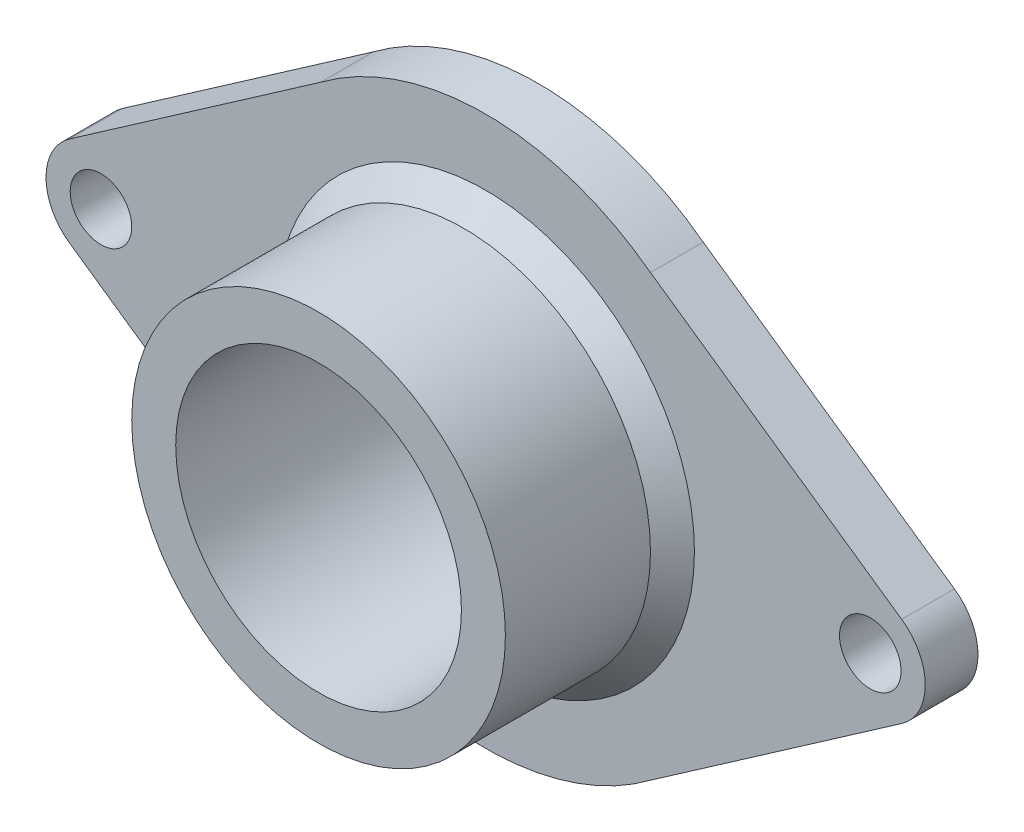
ISO-10303-21;
HEADER;
FILE_DESCRIPTION(('STEP AP214'),'2;1');
FILE_NAME('part.step','',(''),(''),'','','');
FILE_SCHEMA(('AUTOMOTIVE_DESIGN { 1 0 10303 214 1 1 1 1 }'));
ENDSEC;
DATA;
#1=APPLICATION_CONTEXT('core data for automotive mechanical design processes');
#2=APPLICATION_PROTOCOL_DEFINITION('international standard','automotive_design',2000,#1);
#3=PRODUCT_CONTEXT('',#1,'mechanical');
#4=PRODUCT('Part','Part','',(#3));
#5=PRODUCT_RELATED_PRODUCT_CATEGORY('part','',(#4));
#6=PRODUCT_DEFINITION_FORMATION('','',#4);
#7=PRODUCT_DEFINITION_CONTEXT('part definition',#1,'design');
#8=PRODUCT_DEFINITION('design','',#6,#7);
#9=PRODUCT_DEFINITION_SHAPE('','',#8);
#10=(LENGTH_UNIT() NAMED_UNIT(*) SI_UNIT(.MILLI.,.METRE.));
#11=(NAMED_UNIT(*) PLANE_ANGLE_UNIT() SI_UNIT($,.RADIAN.));
#12=(NAMED_UNIT(*) SI_UNIT($,.STERADIAN.) SOLID_ANGLE_UNIT());
#13=UNCERTAINTY_MEASURE_WITH_UNIT(LENGTH_MEASURE(1.E-05),#10,'distance_accuracy_value','');
#14=(GEOMETRIC_REPRESENTATION_CONTEXT(3) GLOBAL_UNCERTAINTY_ASSIGNED_CONTEXT((#13)) GLOBAL_UNIT_ASSIGNED_CONTEXT((#10,
#11,#12)) REPRESENTATION_CONTEXT('',''));
#15=CARTESIAN_POINT('',(0.,0.,0.));
#16=DIRECTION('',(0.,0.,1.));
#17=DIRECTION('',(1.,0.,0.));
#18=AXIS2_PLACEMENT_3D('',#15,#16,#17);
#19=CARTESIAN_POINT('',(0.,0.,50.));
#20=DIRECTION('',(0.,0.,-1.));
#21=DIRECTION('',(-1.,0.,0.));
#22=AXIS2_PLACEMENT_3D('',#19,#20,#21);
#23=CYLINDRICAL_SURFACE('',#22,42.5);
#24=CARTESIAN_POINT('',(0.,0.,16.9999999999999));
#25=DIRECTION('',(0.,0.,-1.));
#26=DIRECTION('',(-1.,0.,0.));
#27=AXIS2_PLACEMENT_3D('',#24,#25,#26);
#28=CIRCLE('',#27,42.5);
#29=CARTESIAN_POINT('',(-42.5,0.,16.9999999999999));
#30=VERTEX_POINT('',#29);
#31=EDGE_CURVE('E11',#30,#30,#28,.F.);
#32=ORIENTED_EDGE('',*,*,#31,.T.);
#33=EDGE_LOOP('',(#32));
#34=FACE_BOUND('',#33,.T.);
#35=CARTESIAN_POINT('',(0.,0.,50.));
#36=DIRECTION('',(0.,0.,1.));
#37=DIRECTION('',(1.,0.,0.));
#38=AXIS2_PLACEMENT_3D('',#35,#36,#37);
#39=CIRCLE('',#38,42.5);
#40=CARTESIAN_POINT('',(42.5,0.,50.));
#41=VERTEX_POINT('',#40);
#42=EDGE_CURVE('E170',#41,#41,#39,.T.);
#43=ORIENTED_EDGE('',*,*,#42,.F.);
#44=EDGE_LOOP('',(#43));
#45=FACE_BOUND('',#44,.T.);
#46=ADVANCED_FACE('F33',(#34,#45),#23,.T.);
#47=CARTESIAN_POINT('',(0.,0.,50.));
#48=DIRECTION('',(0.,0.,1.));
#49=DIRECTION('',(1.,0.,0.));
#50=AXIS2_PLACEMENT_3D('',#47,#48,#49);
#51=PLANE('',#50);
#52=ORIENTED_EDGE('',*,*,#42,.T.);
#53=EDGE_LOOP('',(#52));
#54=FACE_BOUND('',#53,.T.);
#55=CARTESIAN_POINT('',(0.,0.,50.));
#56=DIRECTION('',(0.,0.,1.));
#57=DIRECTION('',(1.,0.,0.));
#58=AXIS2_PLACEMENT_3D('',#55,#56,#57);
#59=CIRCLE('',#58,32.5);
#60=CARTESIAN_POINT('',(32.5,0.,50.));
#61=VERTEX_POINT('',#60);
#62=EDGE_CURVE('E167',#61,#61,#59,.T.);
#63=ORIENTED_EDGE('',*,*,#62,.F.);
#64=EDGE_LOOP('',(#63));
#65=FACE_BOUND('',#64,.T.);
#66=ADVANCED_FACE('F197',(#54,#65),#51,.T.);
#67=CARTESIAN_POINT('',(0.,0.,0.));
#68=DIRECTION('',(0.,0.,1.));
#69=DIRECTION('',(1.,0.,0.));
#70=AXIS2_PLACEMENT_3D('',#67,#68,#69);
#71=PLANE('',#70);
#72=CARTESIAN_POINT('',(-87.5000000000338,0.,0.));
#73=DIRECTION('',(0.,0.,1.));
#74=DIRECTION('',(1.,0.,0.));
#75=AXIS2_PLACEMENT_3D('',#72,#73,#74);
#76=CIRCLE('',#75,7.);
#77=CARTESIAN_POINT('',(-80.5000000000338,0.,0.));
#78=VERTEX_POINT('',#77);
#79=EDGE_CURVE('E137',#78,#78,#76,.T.);
#80=ORIENTED_EDGE('',*,*,#79,.T.);
#81=EDGE_LOOP('',(#80));
#82=FACE_BOUND('',#81,.T.);
#83=CARTESIAN_POINT('',(87.5000000000338,0.,0.));
#84=DIRECTION('',(0.,0.,1.));
#85=DIRECTION('',(1.,0.,0.));
#86=AXIS2_PLACEMENT_3D('',#83,#84,#85);
#87=CIRCLE('',#86,7.);
#88=CARTESIAN_POINT('',(94.5000000000338,0.,0.));
#89=VERTEX_POINT('',#88);
#90=EDGE_CURVE('E178',#89,#89,#87,.T.);
#91=ORIENTED_EDGE('',*,*,#90,.T.);
#92=EDGE_LOOP('',(#91));
#93=FACE_BOUND('',#92,.T.);
#94=CARTESIAN_POINT('',(0.,0.,0.));
#95=DIRECTION('',(0.,0.,1.));
#96=DIRECTION('',(1.,0.,0.));
#97=AXIS2_PLACEMENT_3D('',#94,#95,#96);
#98=CIRCLE('',#97,32.5);
#99=CARTESIAN_POINT('',(32.5,0.,0.));
#100=VERTEX_POINT('',#99);
#101=EDGE_CURVE('E157',#100,#100,#98,.T.);
#102=ORIENTED_EDGE('',*,*,#101,.T.);
#103=EDGE_LOOP('',(#102));
#104=FACE_BOUND('',#103,.T.);
#105=CARTESIAN_POINT('',(0.,0.,0.));
#106=DIRECTION('',(0.,0.,-1.));
#107=DIRECTION('',(-1.,0.,0.));
#108=AXIS2_PLACEMENT_3D('',#105,#106,#107);
#109=CIRCLE('',#108,62.5);
#110=CARTESIAN_POINT('',(37.5000000007826,-49.9999999994131,0.));
#111=VERTEX_POINT('',#110);
#112=CARTESIAN_POINT('',(-37.5000000007826,-49.9999999994131,0.));
#113=VERTEX_POINT('',#112);
#114=EDGE_CURVE('E133',#111,#113,#109,.T.);
#115=ORIENTED_EDGE('',*,*,#114,.T.);
#116=DIRECTION('',(-0.820970545354198,0.570970545353112,0.));
#117=VECTOR('',#116,1.);
#118=CARTESIAN_POINT('',(-37.5000000007826,-49.9999999994131,0.));
#119=LINE('',#118,#117);
#120=CARTESIAN_POINT('',(-94.6371318169477,-10.2621318169275,0.));
#121=VERTEX_POINT('',#120);
#122=EDGE_CURVE('E136',#113,#121,#119,.T.);
#123=ORIENTED_EDGE('',*,*,#122,.T.);
#124=CARTESIAN_POINT('',(-87.5000000000338,0.,0.));
#125=DIRECTION('',(0.,0.,-1.));
#126=DIRECTION('',(-1.,0.,0.));
#127=AXIS2_PLACEMENT_3D('',#124,#125,#126);
#128=CIRCLE('',#127,12.5);
#129=CARTESIAN_POINT('',(-94.6371318169477,10.2621318169275,0.));
#130=VERTEX_POINT('',#129);
#131=EDGE_CURVE('E140',#121,#130,#128,.T.);
#132=ORIENTED_EDGE('',*,*,#131,.T.);
#133=DIRECTION('',(0.820970545354198,0.570970545353112,0.));
#134=VECTOR('',#133,1.);
#135=CARTESIAN_POINT('',(-37.5000000007826,49.9999999994131,0.));
#136=LINE('',#135,#134);
#137=CARTESIAN_POINT('',(-37.5000000007826,49.9999999994131,0.));
#138=VERTEX_POINT('',#137);
#139=EDGE_CURVE('E143',#130,#138,#136,.T.);
#140=ORIENTED_EDGE('',*,*,#139,.T.);
#141=CARTESIAN_POINT('',(0.,0.,0.));
#142=DIRECTION('',(0.,0.,-1.));
#143=DIRECTION('',(-1.,0.,0.));
#144=AXIS2_PLACEMENT_3D('',#141,#142,#143);
#145=CIRCLE('',#144,62.5);
#146=CARTESIAN_POINT('',(37.5000000007826,49.9999999994131,0.));
#147=VERTEX_POINT('',#146);
#148=EDGE_CURVE('E146',#138,#147,#145,.T.);
#149=ORIENTED_EDGE('',*,*,#148,.T.);
#150=DIRECTION('',(0.820970545354198,-0.570970545353112,0.));
#151=VECTOR('',#150,1.);
#152=CARTESIAN_POINT('',(37.5000000007826,49.9999999994131,0.));
#153=LINE('',#152,#151);
#154=CARTESIAN_POINT('',(94.6371318169477,10.2621318169275,0.));
#155=VERTEX_POINT('',#154);
#156=EDGE_CURVE('E149',#147,#155,#153,.T.);
#157=ORIENTED_EDGE('',*,*,#156,.T.);
#158=CARTESIAN_POINT('',(87.5000000000338,0.,0.));
#159=DIRECTION('',(0.,0.,-1.));
#160=DIRECTION('',(-1.,0.,0.));
#161=AXIS2_PLACEMENT_3D('',#158,#159,#160);
#162=CIRCLE('',#161,12.5);
#163=CARTESIAN_POINT('',(94.6371318169477,-10.2621318169275,0.));
#164=VERTEX_POINT('',#163);
#165=EDGE_CURVE('E110',#155,#164,#162,.T.);
#166=ORIENTED_EDGE('',*,*,#165,.T.);
#167=DIRECTION('',(-0.820970545354199,-0.570970545353112,0.));
#168=VECTOR('',#167,1.);
#169=CARTESIAN_POINT('',(37.5000000007826,-49.9999999994131,0.));
#170=LINE('',#169,#168);
#171=EDGE_CURVE('E152',#164,#111,#170,.T.);
#172=ORIENTED_EDGE('',*,*,#171,.T.);
#173=EDGE_LOOP('',(#115,#123,#132,#140,#149,#157,#166,#172));
#174=FACE_BOUND('',#173,.T.);
#175=ADVANCED_FACE('F204',(#82,#93,#104,#174),#71,.F.);
#176=CARTESIAN_POINT('',(0.,0.,50.));
#177=DIRECTION('',(0.,0.,-1.));
#178=DIRECTION('',(-1.,0.,0.));
#179=AXIS2_PLACEMENT_3D('',#176,#177,#178);
#180=CYLINDRICAL_SURFACE('',#179,32.5);
#181=ORIENTED_EDGE('',*,*,#62,.T.);
#182=EDGE_LOOP('',(#181));
#183=FACE_BOUND('',#182,.T.);
#184=ORIENTED_EDGE('',*,*,#101,.F.);
#185=EDGE_LOOP('',(#184));
#186=FACE_BOUND('',#185,.T.);
#187=ADVANCED_FACE('F210',(#183,#186),#180,.F.);
#188=CARTESIAN_POINT('',(0.,0.,12.));
#189=DIRECTION('',(0.,0.,-1.));
#190=DIRECTION('',(-1.,0.,0.));
#191=AXIS2_PLACEMENT_3D('',#188,#189,#190);
#192=CYLINDRICAL_SURFACE('',#191,62.5);
#193=ORIENTED_EDGE('',*,*,#114,.F.);
#194=DIRECTION('',(0.,0.,-1.));
#195=VECTOR('',#194,1.);
#196=CARTESIAN_POINT('',(37.5000000007826,-49.9999999994131,12.));
#197=LINE('',#196,#195);
#198=CARTESIAN_POINT('',(37.5000000007826,-49.9999999994131,12.));
#199=VERTEX_POINT('',#198);
#200=EDGE_CURVE('E50',#199,#111,#197,.T.);
#201=ORIENTED_EDGE('',*,*,#200,.F.);
#202=CARTESIAN_POINT('',(0.,0.,12.));
#203=DIRECTION('',(0.,0.,-1.));
#204=DIRECTION('',(-1.,0.,0.));
#205=AXIS2_PLACEMENT_3D('',#202,#203,#204);
#206=CIRCLE('',#205,62.5);
#207=CARTESIAN_POINT('',(-37.5000000007826,-49.9999999994131,12.));
#208=VERTEX_POINT('',#207);
#209=EDGE_CURVE('E155',#199,#208,#206,.T.);
#210=ORIENTED_EDGE('',*,*,#209,.T.);
#211=DIRECTION('',(0.,0.,-1.));
#212=VECTOR('',#211,1.);
#213=CARTESIAN_POINT('',(-37.5000000007826,-49.9999999994131,12.));
#214=LINE('',#213,#212);
#215=EDGE_CURVE('E91',#208,#113,#214,.T.);
#216=ORIENTED_EDGE('',*,*,#215,.T.);
#217=EDGE_LOOP('',(#193,#201,#210,#216));
#218=FACE_BOUND('',#217,.T.);
#219=ADVANCED_FACE('F215',(#218),#192,.T.);
#220=CARTESIAN_POINT('',(37.5000000007826,-49.9999999994131,12.));
#221=DIRECTION('',(0.570970545353112,-0.820970545354199,0.));
#222=DIRECTION('',(0.820970545354199,0.570970545353112,0.));
#223=AXIS2_PLACEMENT_3D('',#220,#221,#222);
#224=PLANE('',#223);
#225=ORIENTED_EDGE('',*,*,#171,.F.);
#226=DIRECTION('',(0.,0.,-1.));
#227=VECTOR('',#226,1.);
#228=CARTESIAN_POINT('',(94.6371318169477,-10.2621318169275,12.));
#229=LINE('',#228,#227);
#230=CARTESIAN_POINT('',(94.6371318169477,-10.2621318169275,12.));
#231=VERTEX_POINT('',#230);
#232=EDGE_CURVE('E79',#231,#164,#229,.T.);
#233=ORIENTED_EDGE('',*,*,#232,.F.);
#234=DIRECTION('',(-0.820970545354199,-0.570970545353112,0.));
#235=VECTOR('',#234,1.);
#236=CARTESIAN_POINT('',(37.5000000007826,-49.9999999994131,12.));
#237=LINE('',#236,#235);
#238=EDGE_CURVE('E123',#231,#199,#237,.T.);
#239=ORIENTED_EDGE('',*,*,#238,.T.);
#240=ORIENTED_EDGE('',*,*,#200,.T.);
#241=EDGE_LOOP('',(#225,#233,#239,#240));
#242=FACE_BOUND('',#241,.T.);
#243=ADVANCED_FACE('F219',(#242),#224,.T.);
#244=CARTESIAN_POINT('',(87.5000000000338,0.,12.));
#245=DIRECTION('',(0.,0.,-1.));
#246=DIRECTION('',(-1.,0.,0.));
#247=AXIS2_PLACEMENT_3D('',#244,#245,#246);
#248=CYLINDRICAL_SURFACE('',#247,12.5);
#249=ORIENTED_EDGE('',*,*,#165,.F.);
#250=DIRECTION('',(0.,0.,-1.));
#251=VECTOR('',#250,1.);
#252=CARTESIAN_POINT('',(94.6371318169477,10.2621318169275,12.));
#253=LINE('',#252,#251);
#254=CARTESIAN_POINT('',(94.6371318169477,10.2621318169275,12.));
#255=VERTEX_POINT('',#254);
#256=EDGE_CURVE('E105',#255,#155,#253,.T.);
#257=ORIENTED_EDGE('',*,*,#256,.F.);
#258=CARTESIAN_POINT('',(87.5000000000338,0.,12.));
#259=DIRECTION('',(0.,0.,-1.));
#260=DIRECTION('',(-1.,0.,0.));
#261=AXIS2_PLACEMENT_3D('',#258,#259,#260);
#262=CIRCLE('',#261,12.5);
#263=EDGE_CURVE('E108',#255,#231,#262,.T.);
#264=ORIENTED_EDGE('',*,*,#263,.T.);
#265=ORIENTED_EDGE('',*,*,#232,.T.);
#266=EDGE_LOOP('',(#249,#257,#264,#265));
#267=FACE_BOUND('',#266,.T.);
#268=ADVANCED_FACE('F107',(#267),#248,.T.);
#269=CARTESIAN_POINT('',(37.5000000007826,49.9999999994131,12.));
#270=DIRECTION('',(0.570970545353112,0.820970545354198,0.));
#271=DIRECTION('',(-0.820970545354198,0.570970545353112,0.));
#272=AXIS2_PLACEMENT_3D('',#269,#270,#271);
#273=PLANE('',#272);
#274=ORIENTED_EDGE('',*,*,#156,.F.);
#275=DIRECTION('',(0.,0.,-1.));
#276=VECTOR('',#275,1.);
#277=CARTESIAN_POINT('',(37.5000000007826,49.9999999994131,12.));
#278=LINE('',#277,#276);
#279=CARTESIAN_POINT('',(37.5000000007826,49.9999999994131,12.));
#280=VERTEX_POINT('',#279);
#281=EDGE_CURVE('E115',#280,#147,#278,.T.);
#282=ORIENTED_EDGE('',*,*,#281,.F.);
#283=DIRECTION('',(0.820970545354198,-0.570970545353112,0.));
#284=VECTOR('',#283,1.);
#285=CARTESIAN_POINT('',(37.5000000007826,49.9999999994131,12.));
#286=LINE('',#285,#284);
#287=EDGE_CURVE('E121',#280,#255,#286,.T.);
#288=ORIENTED_EDGE('',*,*,#287,.T.);
#289=ORIENTED_EDGE('',*,*,#256,.T.);
#290=EDGE_LOOP('',(#274,#282,#288,#289));
#291=FACE_BOUND('',#290,.T.);
#292=ADVANCED_FACE('F125',(#291),#273,.T.);
#293=CARTESIAN_POINT('',(0.,0.,12.));
#294=DIRECTION('',(0.,0.,-1.));
#295=DIRECTION('',(-1.,0.,0.));
#296=AXIS2_PLACEMENT_3D('',#293,#294,#295);
#297=CYLINDRICAL_SURFACE('',#296,62.5);
#298=ORIENTED_EDGE('',*,*,#148,.F.);
#299=DIRECTION('',(0.,0.,-1.));
#300=VECTOR('',#299,1.);
#301=CARTESIAN_POINT('',(-37.5000000007826,49.9999999994131,12.));
#302=LINE('',#301,#300);
#303=CARTESIAN_POINT('',(-37.5000000007826,49.9999999994131,12.));
#304=VERTEX_POINT('',#303);
#305=EDGE_CURVE('E160',#304,#138,#302,.T.);
#306=ORIENTED_EDGE('',*,*,#305,.F.);
#307=CARTESIAN_POINT('',(0.,0.,12.));
#308=DIRECTION('',(0.,0.,-1.));
#309=DIRECTION('',(-1.,0.,0.));
#310=AXIS2_PLACEMENT_3D('',#307,#308,#309);
#311=CIRCLE('',#310,62.5);
#312=EDGE_CURVE('E126',#304,#280,#311,.T.);
#313=ORIENTED_EDGE('',*,*,#312,.T.);
#314=ORIENTED_EDGE('',*,*,#281,.T.);
#315=EDGE_LOOP('',(#298,#306,#313,#314));
#316=FACE_BOUND('',#315,.T.);
#317=ADVANCED_FACE('F230',(#316),#297,.T.);
#318=CARTESIAN_POINT('',(-37.5000000007826,49.9999999994131,12.));
#319=DIRECTION('',(-0.570970545353112,0.820970545354198,0.));
#320=DIRECTION('',(-0.820970545354198,-0.570970545353112,0.));
#321=AXIS2_PLACEMENT_3D('',#318,#319,#320);
#322=PLANE('',#321);
#323=ORIENTED_EDGE('',*,*,#139,.F.);
#324=DIRECTION('',(0.,0.,-1.));
#325=VECTOR('',#324,1.);
#326=CARTESIAN_POINT('',(-94.6371318169477,10.2621318169275,12.));
#327=LINE('',#326,#325);
#328=CARTESIAN_POINT('',(-94.6371318169477,10.2621318169275,12.));
#329=VERTEX_POINT('',#328);
#330=EDGE_CURVE('E162',#329,#130,#327,.T.);
#331=ORIENTED_EDGE('',*,*,#330,.F.);
#332=DIRECTION('',(0.820970545354198,0.570970545353112,0.));
#333=VECTOR('',#332,1.);
#334=CARTESIAN_POINT('',(-37.5000000007826,49.9999999994131,12.));
#335=LINE('',#334,#333);
#336=EDGE_CURVE('E128',#329,#304,#335,.T.);
#337=ORIENTED_EDGE('',*,*,#336,.T.);
#338=ORIENTED_EDGE('',*,*,#305,.T.);
#339=EDGE_LOOP('',(#323,#331,#337,#338));
#340=FACE_BOUND('',#339,.T.);
#341=ADVANCED_FACE('F226',(#340),#322,.T.);
#342=CARTESIAN_POINT('',(-87.5000000000338,0.,12.));
#343=DIRECTION('',(0.,0.,-1.));
#344=DIRECTION('',(-1.,0.,0.));
#345=AXIS2_PLACEMENT_3D('',#342,#343,#344);
#346=CYLINDRICAL_SURFACE('',#345,12.5);
#347=ORIENTED_EDGE('',*,*,#131,.F.);
#348=DIRECTION('',(0.,0.,-1.));
#349=VECTOR('',#348,1.);
#350=CARTESIAN_POINT('',(-94.6371318169477,-10.2621318169275,12.));
#351=LINE('',#350,#349);
#352=CARTESIAN_POINT('',(-94.6371318169477,-10.2621318169275,12.));
#353=VERTEX_POINT('',#352);
#354=EDGE_CURVE('E164',#353,#121,#351,.T.);
#355=ORIENTED_EDGE('',*,*,#354,.F.);
#356=CARTESIAN_POINT('',(-87.5000000000338,0.,12.));
#357=DIRECTION('',(0.,0.,-1.));
#358=DIRECTION('',(-1.,0.,0.));
#359=AXIS2_PLACEMENT_3D('',#356,#357,#358);
#360=CIRCLE('',#359,12.5);
#361=EDGE_CURVE('E259',#353,#329,#360,.T.);
#362=ORIENTED_EDGE('',*,*,#361,.T.);
#363=ORIENTED_EDGE('',*,*,#330,.T.);
#364=EDGE_LOOP('',(#347,#355,#362,#363));
#365=FACE_BOUND('',#364,.T.);
#366=ADVANCED_FACE('F223',(#365),#346,.T.);
#367=CARTESIAN_POINT('',(-37.5000000007826,-49.9999999994131,12.));
#368=DIRECTION('',(-0.570970545353112,-0.820970545354198,0.));
#369=DIRECTION('',(0.820970545354198,-0.570970545353112,0.));
#370=AXIS2_PLACEMENT_3D('',#367,#368,#369);
#371=PLANE('',#370);
#372=ORIENTED_EDGE('',*,*,#122,.F.);
#373=ORIENTED_EDGE('',*,*,#215,.F.);
#374=DIRECTION('',(-0.820970545354198,0.570970545353112,0.));
#375=VECTOR('',#374,1.);
#376=CARTESIAN_POINT('',(-37.5000000007826,-49.9999999994131,12.));
#377=LINE('',#376,#375);
#378=EDGE_CURVE('E257',#208,#353,#377,.T.);
#379=ORIENTED_EDGE('',*,*,#378,.T.);
#380=ORIENTED_EDGE('',*,*,#354,.T.);
#381=EDGE_LOOP('',(#372,#373,#379,#380));
#382=FACE_BOUND('',#381,.T.);
#383=ADVANCED_FACE('F220',(#382),#371,.T.);
#384=CARTESIAN_POINT('',(0.,0.,12.));
#385=DIRECTION('',(0.,0.,-1.));
#386=DIRECTION('',(-1.,0.,0.));
#387=AXIS2_PLACEMENT_3D('',#384,#385,#386);
#388=PLANE('',#387);
#389=CARTESIAN_POINT('',(0.,0.,12.));
#390=DIRECTION('',(0.,0.,-1.));
#391=DIRECTION('',(-1.,0.,0.));
#392=AXIS2_PLACEMENT_3D('',#389,#390,#391);
#393=CIRCLE('',#392,47.5);
#394=CARTESIAN_POINT('',(-47.5,0.,12.));
#395=VERTEX_POINT('',#394);
#396=EDGE_CURVE('E42',#395,#395,#393,.T.);
#397=ORIENTED_EDGE('',*,*,#396,.T.);
#398=EDGE_LOOP('',(#397));
#399=FACE_BOUND('',#398,.T.);
#400=CARTESIAN_POINT('',(-87.5000000000338,0.,12.));
#401=DIRECTION('',(0.,0.,-1.));
#402=DIRECTION('',(-1.,0.,0.));
#403=AXIS2_PLACEMENT_3D('',#400,#401,#402);
#404=CIRCLE('',#403,7.);
#405=CARTESIAN_POINT('',(-94.5000000000339,0.,12.));
#406=VERTEX_POINT('',#405);
#407=EDGE_CURVE('E179',#406,#406,#404,.T.);
#408=ORIENTED_EDGE('',*,*,#407,.T.);
#409=EDGE_LOOP('',(#408));
#410=FACE_BOUND('',#409,.T.);
#411=CARTESIAN_POINT('',(87.5000000000338,0.,12.));
#412=DIRECTION('',(0.,0.,-1.));
#413=DIRECTION('',(-1.,0.,0.));
#414=AXIS2_PLACEMENT_3D('',#411,#412,#413);
#415=CIRCLE('',#414,7.);
#416=CARTESIAN_POINT('',(80.5000000000338,0.,12.));
#417=VERTEX_POINT('',#416);
#418=EDGE_CURVE('E175',#417,#417,#415,.T.);
#419=ORIENTED_EDGE('',*,*,#418,.T.);
#420=EDGE_LOOP('',(#419));
#421=FACE_BOUND('',#420,.T.);
#422=ORIENTED_EDGE('',*,*,#209,.F.);
#423=ORIENTED_EDGE('',*,*,#238,.F.);
#424=ORIENTED_EDGE('',*,*,#263,.F.);
#425=ORIENTED_EDGE('',*,*,#287,.F.);
#426=ORIENTED_EDGE('',*,*,#312,.F.);
#427=ORIENTED_EDGE('',*,*,#336,.F.);
#428=ORIENTED_EDGE('',*,*,#361,.F.);
#429=ORIENTED_EDGE('',*,*,#378,.F.);
#430=EDGE_LOOP('',(#422,#423,#424,#425,#426,#427,#428,#429));
#431=FACE_BOUND('',#430,.T.);
#432=ADVANCED_FACE('F119',(#399,#410,#421,#431),#388,.F.);
#433=CARTESIAN_POINT('',(87.5000000000338,0.,50.));
#434=DIRECTION('',(0.,0.,-1.));
#435=DIRECTION('',(-1.,0.,0.));
#436=AXIS2_PLACEMENT_3D('',#433,#434,#435);
#437=CYLINDRICAL_SURFACE('',#436,7.);
#438=ORIENTED_EDGE('',*,*,#418,.F.);
#439=EDGE_LOOP('',(#438));
#440=FACE_BOUND('',#439,.T.);
#441=ORIENTED_EDGE('',*,*,#90,.F.);
#442=EDGE_LOOP('',(#441));
#443=FACE_BOUND('',#442,.T.);
#444=ADVANCED_FACE('F192',(#440,#443),#437,.F.);
#445=CARTESIAN_POINT('',(-87.5000000000338,0.,50.));
#446=DIRECTION('',(0.,0.,-1.));
#447=DIRECTION('',(-1.,0.,0.));
#448=AXIS2_PLACEMENT_3D('',#445,#446,#447);
#449=CYLINDRICAL_SURFACE('',#448,7.);
#450=ORIENTED_EDGE('',*,*,#407,.F.);
#451=EDGE_LOOP('',(#450));
#452=FACE_BOUND('',#451,.T.);
#453=ORIENTED_EDGE('',*,*,#79,.F.);
#454=EDGE_LOOP('',(#453));
#455=FACE_BOUND('',#454,.T.);
#456=ADVANCED_FACE('F187',(#452,#455),#449,.F.);
#457=CARTESIAN_POINT('',(0.,0.,12.));
#458=DIRECTION('',(0.,0.,-1.));
#459=DIRECTION('',(-1.,0.,0.));
#460=AXIS2_PLACEMENT_3D('',#457,#458,#459);
#461=CONICAL_SURFACE('',#460,47.5,0.785398163397452);
#462=CARTESIAN_POINT('',(-42.5,0.,16.9999999999999));
#463=CARTESIAN_POINT('',(-42.5520833333333,0.,16.9479166666666));
#464=CARTESIAN_POINT('',(-42.6041666666667,0.,16.8958333333333));
#465=CARTESIAN_POINT('',(-42.7083333333333,0.,16.7916666666666));
#466=CARTESIAN_POINT('',(-42.7604166666667,0.,16.7395833333333));
#467=CARTESIAN_POINT('',(-42.8645833333333,0.,16.6354166666666));
#468=CARTESIAN_POINT('',(-42.9166666666667,0.,16.5833333333333));
#469=CARTESIAN_POINT('',(-43.0208333333333,0.,16.4791666666666));
#470=CARTESIAN_POINT('',(-43.0729166666667,0.,16.4270833333333));
#471=CARTESIAN_POINT('',(-43.1770833333333,0.,16.3229166666666));
#472=CARTESIAN_POINT('',(-43.2291666666667,0.,16.2708333333333));
#473=CARTESIAN_POINT('',(-43.3333333333333,0.,16.1666666666666));
#474=CARTESIAN_POINT('',(-43.3854166666667,0.,16.1145833333333));
#475=CARTESIAN_POINT('',(-43.4895833333333,0.,16.0104166666666));
#476=CARTESIAN_POINT('',(-43.5416666666667,0.,15.9583333333333));
#477=CARTESIAN_POINT('',(-43.6458333333333,0.,15.8541666666666));
#478=CARTESIAN_POINT('',(-43.6979166666667,0.,15.8020833333333));
#479=CARTESIAN_POINT('',(-43.8020833333333,0.,15.6979166666666));
#480=CARTESIAN_POINT('',(-43.8541666666667,0.,15.6458333333333));
#481=CARTESIAN_POINT('',(-43.9583333333333,0.,15.5416666666666));
#482=CARTESIAN_POINT('',(-44.0104166666667,0.,15.4895833333333));
#483=CARTESIAN_POINT('',(-44.1145833333333,0.,15.3854166666666));
#484=CARTESIAN_POINT('',(-44.1666666666667,0.,15.3333333333333));
#485=CARTESIAN_POINT('',(-44.2708333333333,0.,15.2291666666666));
#486=CARTESIAN_POINT('',(-44.3229166666667,0.,15.1770833333333));
#487=CARTESIAN_POINT('',(-44.4270833333333,0.,15.0729166666666));
#488=CARTESIAN_POINT('',(-44.4791666666667,0.,15.0208333333333));
#489=CARTESIAN_POINT('',(-44.5833333333333,0.,14.9166666666666));
#490=CARTESIAN_POINT('',(-44.6354166666667,0.,14.8645833333333));
#491=CARTESIAN_POINT('',(-44.7395833333333,0.,14.7604166666666));
#492=CARTESIAN_POINT('',(-44.7916666666667,0.,14.7083333333333));
#493=CARTESIAN_POINT('',(-44.8958333333333,0.,14.6041666666666));
#494=CARTESIAN_POINT('',(-44.9479166666667,0.,14.5520833333333));
#495=CARTESIAN_POINT('',(-45.0520833333333,0.,14.4479166666666));
#496=CARTESIAN_POINT('',(-45.1041666666667,0.,14.3958333333333));
#497=CARTESIAN_POINT('',(-45.2083333333333,0.,14.2916666666666));
#498=CARTESIAN_POINT('',(-45.2604166666667,0.,14.2395833333333));
#499=CARTESIAN_POINT('',(-45.3645833333333,0.,14.1354166666666));
#500=CARTESIAN_POINT('',(-45.4166666666667,0.,14.0833333333333));
#501=CARTESIAN_POINT('',(-45.5208333333333,0.,13.9791666666666));
#502=CARTESIAN_POINT('',(-45.5729166666667,0.,13.9270833333333));
#503=CARTESIAN_POINT('',(-45.6770833333333,0.,13.8229166666666));
#504=CARTESIAN_POINT('',(-45.7291666666667,0.,13.7708333333333));
#505=CARTESIAN_POINT('',(-45.8333333333333,0.,13.6666666666666));
#506=CARTESIAN_POINT('',(-45.8854166666667,0.,13.6145833333333));
#507=CARTESIAN_POINT('',(-45.9895833333333,0.,13.5104166666667));
#508=CARTESIAN_POINT('',(-46.0416666666667,0.,13.4583333333333));
#509=CARTESIAN_POINT('',(-46.1458333333333,0.,13.3541666666667));
#510=CARTESIAN_POINT('',(-46.1979166666667,0.,13.3020833333333));
#511=CARTESIAN_POINT('',(-46.3020833333333,0.,13.1979166666667));
#512=CARTESIAN_POINT('',(-46.3541666666667,0.,13.1458333333333));
#513=CARTESIAN_POINT('',(-46.4583333333333,0.,13.0416666666667));
#514=CARTESIAN_POINT('',(-46.5104166666667,0.,12.9895833333333));
#515=CARTESIAN_POINT('',(-46.6145833333333,0.,12.8854166666667));
#516=CARTESIAN_POINT('',(-46.6666666666667,0.,12.8333333333333));
#517=CARTESIAN_POINT('',(-46.7708333333333,0.,12.7291666666667));
#518=CARTESIAN_POINT('',(-46.8229166666667,0.,12.6770833333333));
#519=CARTESIAN_POINT('',(-46.9270833333333,0.,12.5729166666667));
#520=CARTESIAN_POINT('',(-46.9791666666667,0.,12.5208333333333));
#521=CARTESIAN_POINT('',(-47.0833333333333,0.,12.4166666666667));
#522=CARTESIAN_POINT('',(-47.1354166666667,0.,12.3645833333333));
#523=CARTESIAN_POINT('',(-47.2395833333333,0.,12.2604166666667));
#524=CARTESIAN_POINT('',(-47.2916666666667,0.,12.2083333333333));
#525=CARTESIAN_POINT('',(-47.3958333333333,0.,12.1041666666667));
#526=CARTESIAN_POINT('',(-47.4479166666666,0.,12.0520833333333));
#527=CARTESIAN_POINT('',(-47.5,0.,12.));
#528=B_SPLINE_CURVE_WITH_KNOTS('',3,(#462,#463,#464,#465,#466,#467,#468,#469,#470,#471,#472,
#473,#474,#475,#476,#477,#478,#479,#480,#481,#482,#483,#484,#485,#486,#487,#488,#489,#490,#491,
#492,#493,#494,#495,#496,#497,#498,#499,#500,#501,#502,#503,#504,#505,#506,#507,#508,#509,#510,
#511,#512,#513,#514,#515,#516,#517,#518,#519,#520,#521,#522,#523,#524,#525,#526,#527),
.UNSPECIFIED.,.F.,.F.,(4,2,2,2,2,2,2,2,2,2,2,2,2,2,2,2,2,2,2,2,2,2,2,2,2,2,2,2,2,2,2,2,4),(0.,
0.220970869120794,0.441941738241585,0.662912607362382,0.883883476483175,1.10485434560397,
1.32582521472477,1.54679608384556,1.76776695296635,1.98873782208715,2.20970869120794,
2.43067956032874,2.65165042944953,2.87262129857032,3.09359216769112,3.31456303681191,
3.53553390593271,3.7565047750535,3.97747564417429,4.19844651329509,4.41941738241588,
4.64038825153667,4.86135912065747,5.08232998977826,5.30330085889906,5.52427172801985,
5.74524259714064,5.96621346626144,6.18718433538224,6.40815520450303,6.62912607362382,
6.85009694274462,7.07106781186541),.UNSPECIFIED.);
#529=EDGE_CURVE('BSEAM35',#30,#395,#528,.T.);
#530=ORIENTED_EDGE('',*,*,#31,.F.);
#531=ORIENTED_EDGE('',*,*,#396,.F.);
#532=ORIENTED_EDGE('',*,*,#529,.T.);
#533=ORIENTED_EDGE('',*,*,#529,.F.);
#534=EDGE_LOOP('',(#530,#532,#531,#533));
#535=FACE_BOUND('',#534,.T.);
#536=ADVANCED_FACE('F35',(#535),#461,.T.);
#537=CLOSED_SHELL('',(#46,#66,#175,#187,#219,#243,#268,#292,#317,#341,#366,#383,#432,#444,#456,#536));
#538=MANIFOLD_SOLID_BREP('B2',#537);
#539=ADVANCED_BREP_SHAPE_REPRESENTATION('',(#18,#538),#14);
#540=SHAPE_DEFINITION_REPRESENTATION(#9,#539);
ENDSEC;
END-ISO-10303-21;
